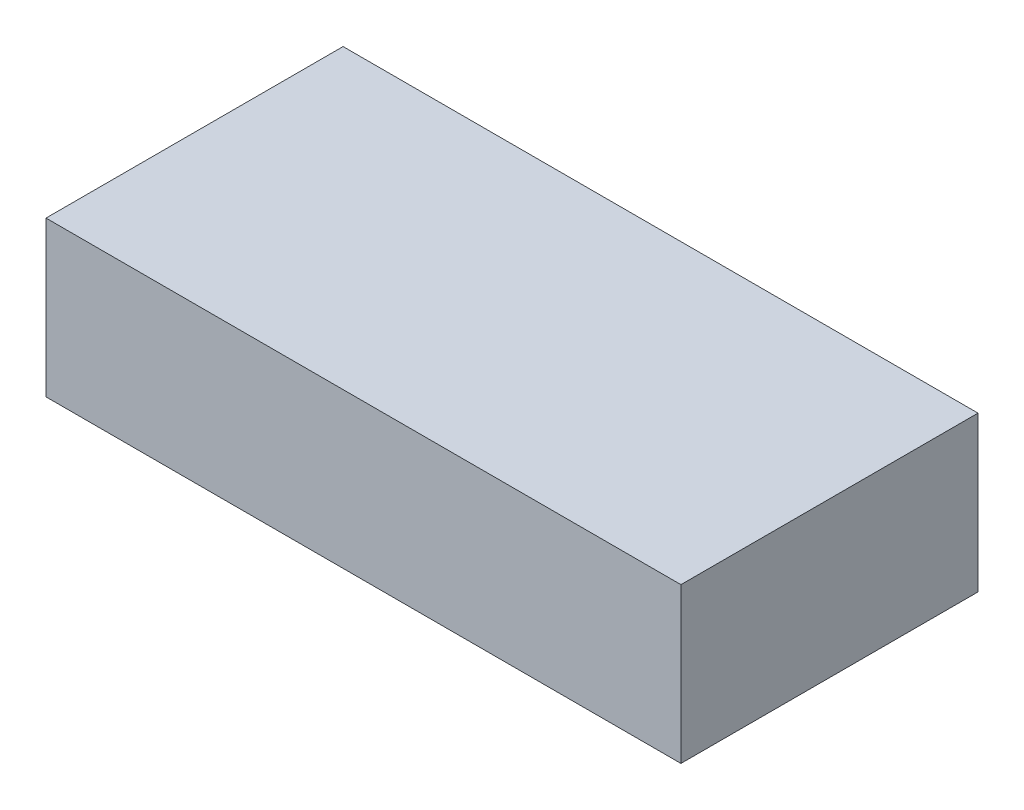
ISO-10303-21;
HEADER;
FILE_DESCRIPTION(('STEP AP214'),'2;1');
FILE_NAME('part.step','',(''),(''),'','','');
FILE_SCHEMA(('AUTOMOTIVE_DESIGN { 1 0 10303 214 1 1 1 1 }'));
ENDSEC;
DATA;
#1=APPLICATION_CONTEXT('core data for automotive mechanical design processes');
#2=APPLICATION_PROTOCOL_DEFINITION('international standard','automotive_design',2000,#1);
#3=PRODUCT_CONTEXT('',#1,'mechanical');
#4=PRODUCT('Part','Part','',(#3));
#5=PRODUCT_RELATED_PRODUCT_CATEGORY('part','',(#4));
#6=PRODUCT_DEFINITION_FORMATION('','',#4);
#7=PRODUCT_DEFINITION_CONTEXT('part definition',#1,'design');
#8=PRODUCT_DEFINITION('design','',#6,#7);
#9=PRODUCT_DEFINITION_SHAPE('','',#8);
#10=(LENGTH_UNIT() NAMED_UNIT(*) SI_UNIT(.MILLI.,.METRE.));
#11=(NAMED_UNIT(*) PLANE_ANGLE_UNIT() SI_UNIT($,.RADIAN.));
#12=(NAMED_UNIT(*) SI_UNIT($,.STERADIAN.) SOLID_ANGLE_UNIT());
#13=UNCERTAINTY_MEASURE_WITH_UNIT(LENGTH_MEASURE(1.E-05),#10,'distance_accuracy_value','');
#14=(GEOMETRIC_REPRESENTATION_CONTEXT(3) GLOBAL_UNCERTAINTY_ASSIGNED_CONTEXT((#13)) GLOBAL_UNIT_ASSIGNED_CONTEXT((#10,
#11,#12)) REPRESENTATION_CONTEXT('',''));
#15=CARTESIAN_POINT('',(0.,0.,0.));
#16=DIRECTION('',(0.,0.,1.));
#17=DIRECTION('',(1.,0.,0.));
#18=AXIS2_PLACEMENT_3D('',#15,#16,#17);
#19=CARTESIAN_POINT('',(44.69,21.8,-20.91));
#20=DIRECTION('',(0.,0.,1.));
#21=DIRECTION('',(1.,0.,0.));
#22=AXIS2_PLACEMENT_3D('',#19,#20,#21);
#23=PLANE('',#22);
#24=DIRECTION('',(-1.,0.,0.));
#25=VECTOR('',#24,1.);
#26=CARTESIAN_POINT('',(44.69,0.,-20.91));
#27=LINE('',#26,#25);
#28=CARTESIAN_POINT('',(44.69,0.,-20.91));
#29=VERTEX_POINT('',#28);
#30=CARTESIAN_POINT('',(-44.69,0.,-20.91));
#31=VERTEX_POINT('',#30);
#32=EDGE_CURVE('E103',#29,#31,#27,.T.);
#33=ORIENTED_EDGE('',*,*,#32,.T.);
#34=DIRECTION('',(0.,-1.,0.));
#35=VECTOR('',#34,1.);
#36=CARTESIAN_POINT('',(-44.69,21.8,-20.91));
#37=LINE('',#36,#35);
#38=CARTESIAN_POINT('',(-44.69,21.8,-20.91));
#39=VERTEX_POINT('',#38);
#40=EDGE_CURVE('E11',#39,#31,#37,.T.);
#41=ORIENTED_EDGE('',*,*,#40,.F.);
#42=DIRECTION('',(-1.,0.,0.));
#43=VECTOR('',#42,1.);
#44=CARTESIAN_POINT('',(44.69,21.8,-20.91));
#45=LINE('',#44,#43);
#46=CARTESIAN_POINT('',(44.69,21.8,-20.91));
#47=VERTEX_POINT('',#46);
#48=EDGE_CURVE('E80',#47,#39,#45,.T.);
#49=ORIENTED_EDGE('',*,*,#48,.F.);
#50=DIRECTION('',(0.,-1.,0.));
#51=VECTOR('',#50,1.);
#52=CARTESIAN_POINT('',(44.69,21.8,-20.91));
#53=LINE('',#52,#51);
#54=EDGE_CURVE('E99',#47,#29,#53,.T.);
#55=ORIENTED_EDGE('',*,*,#54,.T.);
#56=EDGE_LOOP('',(#33,#41,#49,#55));
#57=FACE_BOUND('',#56,.T.);
#58=ADVANCED_FACE('F41',(#57),#23,.F.);
#59=CARTESIAN_POINT('',(-44.69,21.8,20.91));
#60=DIRECTION('',(-1.,0.,0.));
#61=DIRECTION('',(0.,0.,1.));
#62=AXIS2_PLACEMENT_3D('',#59,#60,#61);
#63=PLANE('',#62);
#64=DIRECTION('',(0.,0.,-1.));
#65=VECTOR('',#64,1.);
#66=CARTESIAN_POINT('',(-44.69,0.,20.91));
#67=LINE('',#66,#65);
#68=CARTESIAN_POINT('',(-44.69,0.,20.91));
#69=VERTEX_POINT('',#68);
#70=EDGE_CURVE('E89',#69,#31,#67,.T.);
#71=ORIENTED_EDGE('',*,*,#70,.F.);
#72=DIRECTION('',(0.,-1.,0.));
#73=VECTOR('',#72,1.);
#74=CARTESIAN_POINT('',(-44.69,21.8,20.91));
#75=LINE('',#74,#73);
#76=CARTESIAN_POINT('',(-44.69,21.8,20.91));
#77=VERTEX_POINT('',#76);
#78=EDGE_CURVE('E49',#77,#69,#75,.T.);
#79=ORIENTED_EDGE('',*,*,#78,.F.);
#80=DIRECTION('',(0.,0.,-1.));
#81=VECTOR('',#80,1.);
#82=CARTESIAN_POINT('',(-44.69,21.8,20.91));
#83=LINE('',#82,#81);
#84=EDGE_CURVE('E87',#77,#39,#83,.T.);
#85=ORIENTED_EDGE('',*,*,#84,.T.);
#86=ORIENTED_EDGE('',*,*,#40,.T.);
#87=EDGE_LOOP('',(#71,#79,#85,#86));
#88=FACE_BOUND('',#87,.T.);
#89=ADVANCED_FACE('F86',(#88),#63,.T.);
#90=CARTESIAN_POINT('',(44.69,21.8,20.91));
#91=DIRECTION('',(0.,0.,1.));
#92=DIRECTION('',(1.,0.,0.));
#93=AXIS2_PLACEMENT_3D('',#90,#91,#92);
#94=PLANE('',#93);
#95=DIRECTION('',(-1.,0.,0.));
#96=VECTOR('',#95,1.);
#97=CARTESIAN_POINT('',(44.69,0.,20.91));
#98=LINE('',#97,#96);
#99=CARTESIAN_POINT('',(44.69,0.,20.91));
#100=VERTEX_POINT('',#99);
#101=EDGE_CURVE('E108',#100,#69,#98,.T.);
#102=ORIENTED_EDGE('',*,*,#101,.F.);
#103=DIRECTION('',(0.,-1.,0.));
#104=VECTOR('',#103,1.);
#105=CARTESIAN_POINT('',(44.69,21.8,20.91));
#106=LINE('',#105,#104);
#107=CARTESIAN_POINT('',(44.69,21.8,20.91));
#108=VERTEX_POINT('',#107);
#109=EDGE_CURVE('E72',#108,#100,#106,.T.);
#110=ORIENTED_EDGE('',*,*,#109,.F.);
#111=DIRECTION('',(-1.,0.,0.));
#112=VECTOR('',#111,1.);
#113=CARTESIAN_POINT('',(44.69,21.8,20.91));
#114=LINE('',#113,#112);
#115=EDGE_CURVE('E95',#108,#77,#114,.T.);
#116=ORIENTED_EDGE('',*,*,#115,.T.);
#117=ORIENTED_EDGE('',*,*,#78,.T.);
#118=EDGE_LOOP('',(#102,#110,#116,#117));
#119=FACE_BOUND('',#118,.T.);
#120=ADVANCED_FACE('F97',(#119),#94,.T.);
#121=CARTESIAN_POINT('',(44.69,21.8,20.91));
#122=DIRECTION('',(-1.,0.,0.));
#123=DIRECTION('',(0.,0.,1.));
#124=AXIS2_PLACEMENT_3D('',#121,#122,#123);
#125=PLANE('',#124);
#126=DIRECTION('',(0.,0.,-1.));
#127=VECTOR('',#126,1.);
#128=CARTESIAN_POINT('',(44.69,0.,20.91));
#129=LINE('',#128,#127);
#130=EDGE_CURVE('E75',#100,#29,#129,.T.);
#131=ORIENTED_EDGE('',*,*,#130,.T.);
#132=ORIENTED_EDGE('',*,*,#54,.F.);
#133=DIRECTION('',(0.,0.,-1.));
#134=VECTOR('',#133,1.);
#135=CARTESIAN_POINT('',(44.69,21.8,20.91));
#136=LINE('',#135,#134);
#137=EDGE_CURVE('E57',#108,#47,#136,.T.);
#138=ORIENTED_EDGE('',*,*,#137,.F.);
#139=ORIENTED_EDGE('',*,*,#109,.T.);
#140=EDGE_LOOP('',(#131,#132,#138,#139));
#141=FACE_BOUND('',#140,.T.);
#142=ADVANCED_FACE('F127',(#141),#125,.F.);
#143=CARTESIAN_POINT('',(0.,21.8,0.));
#144=DIRECTION('',(0.,-1.,0.));
#145=DIRECTION('',(0.,0.,-1.));
#146=AXIS2_PLACEMENT_3D('',#143,#144,#145);
#147=PLANE('',#146);
#148=ORIENTED_EDGE('',*,*,#48,.T.);
#149=ORIENTED_EDGE('',*,*,#84,.F.);
#150=ORIENTED_EDGE('',*,*,#115,.F.);
#151=ORIENTED_EDGE('',*,*,#137,.T.);
#152=EDGE_LOOP('',(#148,#149,#150,#151));
#153=FACE_BOUND('',#152,.T.);
#154=ADVANCED_FACE('F94',(#153),#147,.F.);
#155=CARTESIAN_POINT('',(0.,0.,0.));
#156=DIRECTION('',(0.,-1.,0.));
#157=DIRECTION('',(0.,0.,-1.));
#158=AXIS2_PLACEMENT_3D('',#155,#156,#157);
#159=PLANE('',#158);
#160=CARTESIAN_POINT('',(-25.39,0.,11.93));
#161=DIRECTION('',(0.,1.,0.));
#162=DIRECTION('',(0.,0.,1.));
#163=AXIS2_PLACEMENT_3D('',#160,#161,#162);
#164=CIRCLE('',#163,2.2);
#165=CARTESIAN_POINT('',(-25.39,0.,14.13));
#166=VERTEX_POINT('',#165);
#167=EDGE_CURVE('E236',#166,#166,#164,.T.);
#168=ORIENTED_EDGE('',*,*,#167,.T.);
#169=EDGE_LOOP('',(#168));
#170=FACE_BOUND('',#169,.T.);
#171=CARTESIAN_POINT('',(14.65,0.,11.93));
#172=DIRECTION('',(0.,1.,0.));
#173=DIRECTION('',(0.,0.,1.));
#174=AXIS2_PLACEMENT_3D('',#171,#172,#173);
#175=CIRCLE('',#174,2.19999999999999);
#176=CARTESIAN_POINT('',(14.65,0.,14.13));
#177=VERTEX_POINT('',#176);
#178=EDGE_CURVE('E255',#177,#177,#175,.T.);
#179=ORIENTED_EDGE('',*,*,#178,.T.);
#180=EDGE_LOOP('',(#179));
#181=FACE_BOUND('',#180,.T.);
#182=CARTESIAN_POINT('',(14.65,0.,-11.93));
#183=DIRECTION('',(0.,1.,0.));
#184=DIRECTION('',(0.,0.,1.));
#185=AXIS2_PLACEMENT_3D('',#182,#183,#184);
#186=CIRCLE('',#185,2.19999999999999);
#187=CARTESIAN_POINT('',(14.65,0.,-9.73000000000001));
#188=VERTEX_POINT('',#187);
#189=EDGE_CURVE('E246',#188,#188,#186,.T.);
#190=ORIENTED_EDGE('',*,*,#189,.T.);
#191=EDGE_LOOP('',(#190));
#192=FACE_BOUND('',#191,.T.);
#193=CARTESIAN_POINT('',(-25.39,0.,-11.93));
#194=DIRECTION('',(0.,1.,0.));
#195=DIRECTION('',(0.,0.,1.));
#196=AXIS2_PLACEMENT_3D('',#193,#194,#195);
#197=CIRCLE('',#196,2.2);
#198=CARTESIAN_POINT('',(-25.39,0.,-9.73));
#199=VERTEX_POINT('',#198);
#200=EDGE_CURVE('E244',#199,#199,#197,.T.);
#201=ORIENTED_EDGE('',*,*,#200,.T.);
#202=EDGE_LOOP('',(#201));
#203=FACE_BOUND('',#202,.T.);
#204=ORIENTED_EDGE('',*,*,#32,.F.);
#205=ORIENTED_EDGE('',*,*,#130,.F.);
#206=ORIENTED_EDGE('',*,*,#101,.T.);
#207=ORIENTED_EDGE('',*,*,#70,.T.);
#208=EDGE_LOOP('',(#204,#205,#206,#207));
#209=FACE_BOUND('',#208,.T.);
#210=ADVANCED_FACE('F115',(#170,#181,#192,#203,#209),#159,.T.);
#211=CARTESIAN_POINT('',(-25.39,10.,-11.93));
#212=DIRECTION('',(0.,-1.,0.));
#213=DIRECTION('',(0.,0.,-1.));
#214=AXIS2_PLACEMENT_3D('',#211,#212,#213);
#215=CYLINDRICAL_SURFACE('',#214,2.2);
#216=CARTESIAN_POINT('',(-25.39,10.,-11.93));
#217=DIRECTION('',(0.,1.,0.));
#218=DIRECTION('',(0.,0.,1.));
#219=AXIS2_PLACEMENT_3D('',#216,#217,#218);
#220=CIRCLE('',#219,2.2);
#221=CARTESIAN_POINT('',(-25.39,10.,-9.73));
#222=VERTEX_POINT('',#221);
#223=EDGE_CURVE('E106',#222,#222,#220,.T.);
#224=ORIENTED_EDGE('',*,*,#223,.T.);
#225=EDGE_LOOP('',(#224));
#226=FACE_BOUND('',#225,.T.);
#227=ORIENTED_EDGE('',*,*,#200,.F.);
#228=EDGE_LOOP('',(#227));
#229=FACE_BOUND('',#228,.T.);
#230=ADVANCED_FACE('F117',(#226,#229),#215,.F.);
#231=CARTESIAN_POINT('',(-25.39,10.,-11.93));
#232=DIRECTION('',(0.,1.,0.));
#233=DIRECTION('',(0.,0.,1.));
#234=AXIS2_PLACEMENT_3D('',#231,#232,#233);
#235=PLANE('',#234);
#236=ORIENTED_EDGE('',*,*,#223,.F.);
#237=EDGE_LOOP('',(#236));
#238=FACE_BOUND('',#237,.T.);
#239=ADVANCED_FACE('F124',(#238),#235,.F.);
#240=CARTESIAN_POINT('',(14.65,10.,-11.93));
#241=DIRECTION('',(0.,-1.,0.));
#242=DIRECTION('',(0.,0.,-1.));
#243=AXIS2_PLACEMENT_3D('',#240,#241,#242);
#244=CYLINDRICAL_SURFACE('',#243,2.19999999999999);
#245=CARTESIAN_POINT('',(14.65,10.,-11.93));
#246=DIRECTION('',(0.,1.,0.));
#247=DIRECTION('',(0.,0.,1.));
#248=AXIS2_PLACEMENT_3D('',#245,#246,#247);
#249=CIRCLE('',#248,2.19999999999999);
#250=CARTESIAN_POINT('',(14.65,10.,-9.73000000000001));
#251=VERTEX_POINT('',#250);
#252=EDGE_CURVE('E250',#251,#251,#249,.T.);
#253=ORIENTED_EDGE('',*,*,#252,.T.);
#254=EDGE_LOOP('',(#253));
#255=FACE_BOUND('',#254,.T.);
#256=ORIENTED_EDGE('',*,*,#189,.F.);
#257=EDGE_LOOP('',(#256));
#258=FACE_BOUND('',#257,.T.);
#259=ADVANCED_FACE('F170',(#255,#258),#244,.F.);
#260=CARTESIAN_POINT('',(14.65,10.,-11.93));
#261=DIRECTION('',(0.,1.,0.));
#262=DIRECTION('',(0.,0.,1.));
#263=AXIS2_PLACEMENT_3D('',#260,#261,#262);
#264=PLANE('',#263);
#265=ORIENTED_EDGE('',*,*,#252,.F.);
#266=EDGE_LOOP('',(#265));
#267=FACE_BOUND('',#266,.T.);
#268=ADVANCED_FACE('F180',(#267),#264,.F.);
#269=CARTESIAN_POINT('',(14.65,10.,11.93));
#270=DIRECTION('',(0.,-1.,0.));
#271=DIRECTION('',(0.,0.,-1.));
#272=AXIS2_PLACEMENT_3D('',#269,#270,#271);
#273=CYLINDRICAL_SURFACE('',#272,2.19999999999999);
#274=CARTESIAN_POINT('',(14.65,10.,11.93));
#275=DIRECTION('',(0.,1.,0.));
#276=DIRECTION('',(0.,0.,1.));
#277=AXIS2_PLACEMENT_3D('',#274,#275,#276);
#278=CIRCLE('',#277,2.19999999999999);
#279=CARTESIAN_POINT('',(14.65,10.,14.13));
#280=VERTEX_POINT('',#279);
#281=EDGE_CURVE('E238',#280,#280,#278,.T.);
#282=ORIENTED_EDGE('',*,*,#281,.T.);
#283=EDGE_LOOP('',(#282));
#284=FACE_BOUND('',#283,.T.);
#285=ORIENTED_EDGE('',*,*,#178,.F.);
#286=EDGE_LOOP('',(#285));
#287=FACE_BOUND('',#286,.T.);
#288=ADVANCED_FACE('F190',(#284,#287),#273,.F.);
#289=CARTESIAN_POINT('',(14.65,10.,11.93));
#290=DIRECTION('',(0.,1.,0.));
#291=DIRECTION('',(0.,0.,1.));
#292=AXIS2_PLACEMENT_3D('',#289,#290,#291);
#293=PLANE('',#292);
#294=ORIENTED_EDGE('',*,*,#281,.F.);
#295=EDGE_LOOP('',(#294));
#296=FACE_BOUND('',#295,.T.);
#297=ADVANCED_FACE('F200',(#296),#293,.F.);
#298=CARTESIAN_POINT('',(-25.39,10.,11.93));
#299=DIRECTION('',(0.,-1.,0.));
#300=DIRECTION('',(0.,0.,-1.));
#301=AXIS2_PLACEMENT_3D('',#298,#299,#300);
#302=CYLINDRICAL_SURFACE('',#301,2.2);
#303=CARTESIAN_POINT('',(-25.39,10.,11.93));
#304=DIRECTION('',(0.,1.,0.));
#305=DIRECTION('',(0.,0.,1.));
#306=AXIS2_PLACEMENT_3D('',#303,#304,#305);
#307=CIRCLE('',#306,2.2);
#308=CARTESIAN_POINT('',(-25.39,10.,14.13));
#309=VERTEX_POINT('',#308);
#310=EDGE_CURVE('E235',#309,#309,#307,.T.);
#311=ORIENTED_EDGE('',*,*,#310,.T.);
#312=EDGE_LOOP('',(#311));
#313=FACE_BOUND('',#312,.T.);
#314=ORIENTED_EDGE('',*,*,#167,.F.);
#315=EDGE_LOOP('',(#314));
#316=FACE_BOUND('',#315,.T.);
#317=ADVANCED_FACE('F210',(#313,#316),#302,.F.);
#318=CARTESIAN_POINT('',(-25.39,10.,11.93));
#319=DIRECTION('',(0.,1.,0.));
#320=DIRECTION('',(0.,0.,1.));
#321=AXIS2_PLACEMENT_3D('',#318,#319,#320);
#322=PLANE('',#321);
#323=ORIENTED_EDGE('',*,*,#310,.F.);
#324=EDGE_LOOP('',(#323));
#325=FACE_BOUND('',#324,.T.);
#326=ADVANCED_FACE('F220',(#325),#322,.F.);
#327=CLOSED_SHELL('',(#58,#89,#120,#142,#154,#210,#230,#239,#259,#268,#288,#297,#317,#326));
#328=MANIFOLD_SOLID_BREP('B2',#327);
#329=ADVANCED_BREP_SHAPE_REPRESENTATION('',(#18,#328),#14);
#330=SHAPE_DEFINITION_REPRESENTATION(#9,#329);
ENDSEC;
END-ISO-10303-21;
